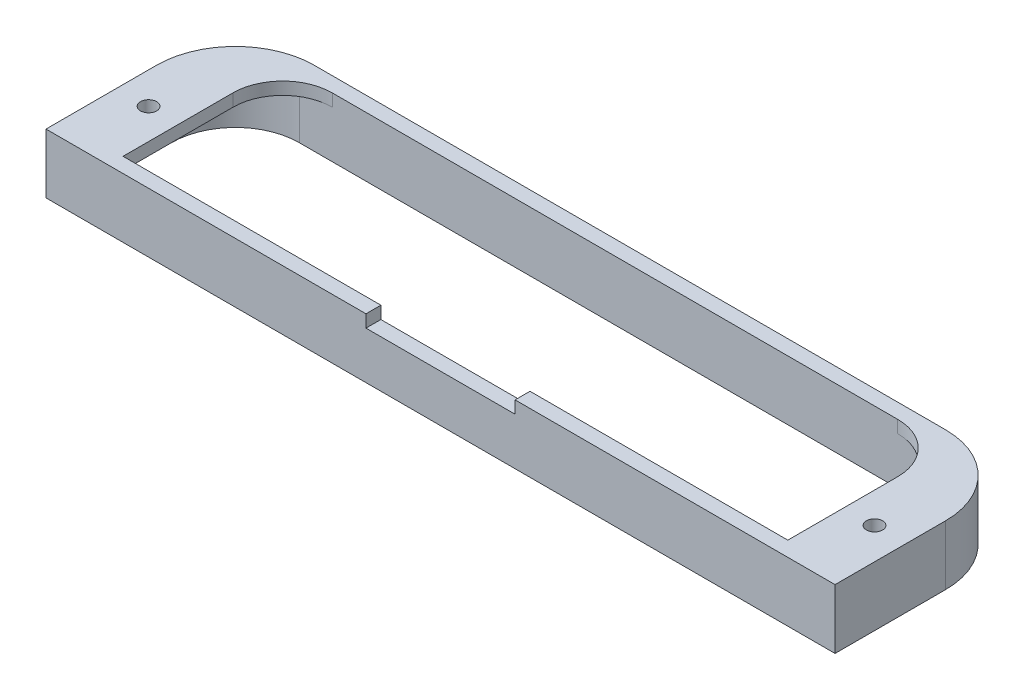
ISO-10303-21;
HEADER;
FILE_DESCRIPTION(('STEP AP214'),'2;1');
FILE_NAME('part.step','',(''),(''),'','','');
FILE_SCHEMA(('AUTOMOTIVE_DESIGN { 1 0 10303 214 1 1 1 1 }'));
ENDSEC;
DATA;
#1=APPLICATION_CONTEXT('core data for automotive mechanical design processes');
#2=APPLICATION_PROTOCOL_DEFINITION('international standard','automotive_design',2000,#1);
#3=PRODUCT_CONTEXT('',#1,'mechanical');
#4=PRODUCT('Part','Part','',(#3));
#5=PRODUCT_RELATED_PRODUCT_CATEGORY('part','',(#4));
#6=PRODUCT_DEFINITION_FORMATION('','',#4);
#7=PRODUCT_DEFINITION_CONTEXT('part definition',#1,'design');
#8=PRODUCT_DEFINITION('design','',#6,#7);
#9=PRODUCT_DEFINITION_SHAPE('','',#8);
#10=(LENGTH_UNIT() NAMED_UNIT(*) SI_UNIT(.MILLI.,.METRE.));
#11=(NAMED_UNIT(*) PLANE_ANGLE_UNIT() SI_UNIT($,.RADIAN.));
#12=(NAMED_UNIT(*) SI_UNIT($,.STERADIAN.) SOLID_ANGLE_UNIT());
#13=UNCERTAINTY_MEASURE_WITH_UNIT(LENGTH_MEASURE(1.E-05),#10,'distance_accuracy_value','');
#14=(GEOMETRIC_REPRESENTATION_CONTEXT(3) GLOBAL_UNCERTAINTY_ASSIGNED_CONTEXT((#13)) GLOBAL_UNIT_ASSIGNED_CONTEXT((#10,
#11,#12)) REPRESENTATION_CONTEXT('',''));
#15=CARTESIAN_POINT('',(0.,0.,0.));
#16=DIRECTION('',(0.,0.,1.));
#17=DIRECTION('',(1.,0.,0.));
#18=AXIS2_PLACEMENT_3D('',#15,#16,#17);
#19=CARTESIAN_POINT('',(50.8,0.,-17.78));
#20=DIRECTION('',(0.,1.,0.));
#21=DIRECTION('',(0.,0.,1.));
#22=AXIS2_PLACEMENT_3D('',#19,#20,#21);
#23=PLANE('',#22);
#24=CARTESIAN_POINT('',(-58.42,0.,-11.43));
#25=DIRECTION('',(0.,1.,0.));
#26=DIRECTION('',(0.,0.,1.));
#27=AXIS2_PLACEMENT_3D('',#24,#25,#26);
#28=CIRCLE('',#27,1.3);
#29=CARTESIAN_POINT('',(-58.42,0.,-10.13));
#30=VERTEX_POINT('',#29);
#31=EDGE_CURVE('E279',#30,#30,#28,.T.);
#32=ORIENTED_EDGE('',*,*,#31,.T.);
#33=EDGE_LOOP('',(#32));
#34=FACE_BOUND('',#33,.T.);
#35=DIRECTION('',(0.,0.,1.));
#36=VECTOR('',#35,1.);
#37=CARTESIAN_POINT('',(-53.5,0.,-2.4));
#38=LINE('',#37,#36);
#39=CARTESIAN_POINT('',(-53.5,0.,-20.08));
#40=VERTEX_POINT('',#39);
#41=CARTESIAN_POINT('',(-53.5,0.,-2.4));
#42=VERTEX_POINT('',#41);
#43=EDGE_CURVE('E306',#40,#42,#38,.T.);
#44=ORIENTED_EDGE('',*,*,#43,.T.);
#45=DIRECTION('',(-1.,0.,0.));
#46=VECTOR('',#45,1.);
#47=CARTESIAN_POINT('',(61.1,0.,-2.4));
#48=LINE('',#47,#46);
#49=CARTESIAN_POINT('',(-61.1,0.,-2.4));
#50=VERTEX_POINT('',#49);
#51=EDGE_CURVE('E11',#42,#50,#48,.T.);
#52=ORIENTED_EDGE('',*,*,#51,.T.);
#53=DIRECTION('',(0.,0.,-1.));
#54=VECTOR('',#53,1.);
#55=CARTESIAN_POINT('',(-61.1,0.,-2.4));
#56=LINE('',#55,#54);
#57=CARTESIAN_POINT('',(-61.1,0.,-17.78));
#58=VERTEX_POINT('',#57);
#59=EDGE_CURVE('E236',#50,#58,#56,.T.);
#60=ORIENTED_EDGE('',*,*,#59,.T.);
#61=CARTESIAN_POINT('',(-50.8,0.,-17.78));
#62=DIRECTION('',(0.,-1.,0.));
#63=DIRECTION('',(0.,0.,-1.));
#64=AXIS2_PLACEMENT_3D('',#61,#62,#63);
#65=CIRCLE('',#64,10.3);
#66=CARTESIAN_POINT('',(-50.8,0.,-28.08));
#67=VERTEX_POINT('',#66);
#68=EDGE_CURVE('E239',#58,#67,#65,.T.);
#69=ORIENTED_EDGE('',*,*,#68,.T.);
#70=DIRECTION('',(1.,0.,0.));
#71=VECTOR('',#70,1.);
#72=CARTESIAN_POINT('',(-50.8,0.,-28.08));
#73=LINE('',#72,#71);
#74=CARTESIAN_POINT('',(-45.5,0.,-28.08));
#75=VERTEX_POINT('',#74);
#76=EDGE_CURVE('E242',#67,#75,#73,.T.);
#77=ORIENTED_EDGE('',*,*,#76,.T.);
#78=CARTESIAN_POINT('',(-45.5,0.,-20.08));
#79=DIRECTION('',(0.,1.,0.));
#80=DIRECTION('',(0.,0.,-1.));
#81=AXIS2_PLACEMENT_3D('',#78,#79,#80);
#82=CIRCLE('',#81,8.);
#83=EDGE_CURVE('E288',#75,#40,#82,.T.);
#84=ORIENTED_EDGE('',*,*,#83,.T.);
#85=EDGE_LOOP('',(#44,#52,#60,#69,#77,#84));
#86=FACE_BOUND('',#85,.T.);
#87=ADVANCED_FACE('F37',(#34,#86),#23,.F.);
#88=CARTESIAN_POINT('',(58.42,0.,-11.43));
#89=DIRECTION('',(0.,1.,0.));
#90=DIRECTION('',(0.,0.,1.));
#91=AXIS2_PLACEMENT_3D('',#88,#89,#90);
#92=CIRCLE('',#91,1.3);
#93=CARTESIAN_POINT('',(58.42,0.,-10.13));
#94=VERTEX_POINT('',#93);
#95=EDGE_CURVE('E285',#94,#94,#92,.T.);
#96=ORIENTED_EDGE('',*,*,#95,.T.);
#97=EDGE_LOOP('',(#96));
#98=FACE_BOUND('',#97,.T.);
#99=DIRECTION('',(0.,0.,1.));
#100=VECTOR('',#99,1.);
#101=CARTESIAN_POINT('',(61.1,0.,-17.78));
#102=LINE('',#101,#100);
#103=CARTESIAN_POINT('',(61.1,0.,-17.78));
#104=VERTEX_POINT('',#103);
#105=CARTESIAN_POINT('',(61.1,0.,-2.4));
#106=VERTEX_POINT('',#105);
#107=EDGE_CURVE('E232',#104,#106,#102,.T.);
#108=ORIENTED_EDGE('',*,*,#107,.T.);
#109=CARTESIAN_POINT('',(53.5,0.,-2.4));
#110=VERTEX_POINT('',#109);
#111=EDGE_CURVE('E48',#106,#110,#48,.T.);
#112=ORIENTED_EDGE('',*,*,#111,.T.);
#113=DIRECTION('',(0.,0.,-1.));
#114=VECTOR('',#113,1.);
#115=CARTESIAN_POINT('',(53.5,0.,-20.08));
#116=LINE('',#115,#114);
#117=CARTESIAN_POINT('',(53.5,0.,-20.08));
#118=VERTEX_POINT('',#117);
#119=EDGE_CURVE('E309',#110,#118,#116,.T.);
#120=ORIENTED_EDGE('',*,*,#119,.T.);
#121=CARTESIAN_POINT('',(45.5,0.,-20.08));
#122=DIRECTION('',(0.,1.,0.));
#123=DIRECTION('',(0.,0.,-1.));
#124=AXIS2_PLACEMENT_3D('',#121,#122,#123);
#125=CIRCLE('',#124,8.);
#126=CARTESIAN_POINT('',(45.5,0.,-28.08));
#127=VERTEX_POINT('',#126);
#128=EDGE_CURVE('E292',#118,#127,#125,.T.);
#129=ORIENTED_EDGE('',*,*,#128,.T.);
#130=CARTESIAN_POINT('',(50.8,0.,-28.08));
#131=VERTEX_POINT('',#130);
#132=EDGE_CURVE('E46',#127,#131,#73,.T.);
#133=ORIENTED_EDGE('',*,*,#132,.T.);
#134=CARTESIAN_POINT('',(50.8,0.,-17.78));
#135=DIRECTION('',(0.,-1.,0.));
#136=DIRECTION('',(0.,0.,-1.));
#137=AXIS2_PLACEMENT_3D('',#134,#135,#136);
#138=CIRCLE('',#137,10.3);
#139=EDGE_CURVE('E221',#131,#104,#138,.T.);
#140=ORIENTED_EDGE('',*,*,#139,.T.);
#141=EDGE_LOOP('',(#108,#112,#120,#129,#133,#140));
#142=FACE_BOUND('',#141,.T.);
#143=ADVANCED_FACE('F363',(#98,#142),#23,.F.);
#144=CARTESIAN_POINT('',(50.8,2.,-17.78));
#145=DIRECTION('',(0.,1.,0.));
#146=DIRECTION('',(0.,0.,1.));
#147=AXIS2_PLACEMENT_3D('',#144,#145,#146);
#148=PLANE('',#147);
#149=DIRECTION('',(0.,0.,-1.));
#150=VECTOR('',#149,1.);
#151=CARTESIAN_POINT('',(12.,2.,0.));
#152=LINE('',#151,#150);
#153=CARTESIAN_POINT('',(12.,2.,0.));
#154=VERTEX_POINT('',#153);
#155=CARTESIAN_POINT('',(12.,2.,-2.4));
#156=VERTEX_POINT('',#155);
#157=EDGE_CURVE('E205',#154,#156,#152,.T.);
#158=ORIENTED_EDGE('',*,*,#157,.F.);
#159=DIRECTION('',(1.,0.,0.));
#160=VECTOR('',#159,1.);
#161=CARTESIAN_POINT('',(-63.5,2.,0.));
#162=LINE('',#161,#160);
#163=CARTESIAN_POINT('',(63.5,2.,0.));
#164=VERTEX_POINT('',#163);
#165=EDGE_CURVE('E333',#154,#164,#162,.T.);
#166=ORIENTED_EDGE('',*,*,#165,.T.);
#167=DIRECTION('',(0.,0.,-1.));
#168=VECTOR('',#167,1.);
#169=CARTESIAN_POINT('',(63.5,2.,0.));
#170=LINE('',#169,#168);
#171=CARTESIAN_POINT('',(63.5,2.,-17.78));
#172=VERTEX_POINT('',#171);
#173=EDGE_CURVE('E337',#164,#172,#170,.T.);
#174=ORIENTED_EDGE('',*,*,#173,.T.);
#175=CARTESIAN_POINT('',(50.8,2.,-17.78));
#176=DIRECTION('',(0.,1.,0.));
#177=DIRECTION('',(0.,0.,1.));
#178=AXIS2_PLACEMENT_3D('',#175,#176,#177);
#179=CIRCLE('',#178,12.7);
#180=CARTESIAN_POINT('',(50.8,2.,-30.48));
#181=VERTEX_POINT('',#180);
#182=EDGE_CURVE('E339',#172,#181,#179,.T.);
#183=ORIENTED_EDGE('',*,*,#182,.T.);
#184=DIRECTION('',(-1.,0.,0.));
#185=VECTOR('',#184,1.);
#186=CARTESIAN_POINT('',(50.8,2.,-30.48));
#187=LINE('',#186,#185);
#188=CARTESIAN_POINT('',(-50.8,2.,-30.48));
#189=VERTEX_POINT('',#188);
#190=EDGE_CURVE('E341',#181,#189,#187,.T.);
#191=ORIENTED_EDGE('',*,*,#190,.T.);
#192=CARTESIAN_POINT('',(-50.8,2.,-17.78));
#193=DIRECTION('',(0.,1.,0.));
#194=DIRECTION('',(0.,0.,1.));
#195=AXIS2_PLACEMENT_3D('',#192,#193,#194);
#196=CIRCLE('',#195,12.7);
#197=CARTESIAN_POINT('',(-63.5,2.,-17.78));
#198=VERTEX_POINT('',#197);
#199=EDGE_CURVE('E343',#189,#198,#196,.T.);
#200=ORIENTED_EDGE('',*,*,#199,.T.);
#201=DIRECTION('',(0.,0.,1.));
#202=VECTOR('',#201,1.);
#203=CARTESIAN_POINT('',(-63.5,2.,-17.78));
#204=LINE('',#203,#202);
#205=CARTESIAN_POINT('',(-63.5,2.,0.));
#206=VERTEX_POINT('',#205);
#207=EDGE_CURVE('E330',#198,#206,#204,.T.);
#208=ORIENTED_EDGE('',*,*,#207,.T.);
#209=CARTESIAN_POINT('',(-12.,2.,0.));
#210=VERTEX_POINT('',#209);
#211=EDGE_CURVE('E334',#206,#210,#162,.T.);
#212=ORIENTED_EDGE('',*,*,#211,.T.);
#213=DIRECTION('',(0.,0.,1.));
#214=VECTOR('',#213,1.);
#215=CARTESIAN_POINT('',(-12.,2.,-2.4));
#216=LINE('',#215,#214);
#217=CARTESIAN_POINT('',(-12.,2.,-2.4));
#218=VERTEX_POINT('',#217);
#219=EDGE_CURVE('E408',#218,#210,#216,.T.);
#220=ORIENTED_EDGE('',*,*,#219,.F.);
#221=DIRECTION('',(1.,0.,0.));
#222=VECTOR('',#221,1.);
#223=CARTESIAN_POINT('',(-53.5,2.,-2.4));
#224=LINE('',#223,#222);
#225=CARTESIAN_POINT('',(-53.5,2.,-2.4));
#226=VERTEX_POINT('',#225);
#227=EDGE_CURVE('E211',#226,#218,#224,.T.);
#228=ORIENTED_EDGE('',*,*,#227,.F.);
#229=DIRECTION('',(0.,0.,1.));
#230=VECTOR('',#229,1.);
#231=CARTESIAN_POINT('',(-53.5,2.,-2.4));
#232=LINE('',#231,#230);
#233=CARTESIAN_POINT('',(-53.5,2.,-20.08));
#234=VERTEX_POINT('',#233);
#235=EDGE_CURVE('E291',#234,#226,#232,.T.);
#236=ORIENTED_EDGE('',*,*,#235,.F.);
#237=CARTESIAN_POINT('',(-45.5,2.,-20.08));
#238=DIRECTION('',(0.,1.,0.));
#239=DIRECTION('',(0.,0.,-1.));
#240=AXIS2_PLACEMENT_3D('',#237,#238,#239);
#241=CIRCLE('',#240,8.);
#242=CARTESIAN_POINT('',(-45.5,2.,-28.08));
#243=VERTEX_POINT('',#242);
#244=EDGE_CURVE('E289',#243,#234,#241,.T.);
#245=ORIENTED_EDGE('',*,*,#244,.F.);
#246=DIRECTION('',(-1.,0.,0.));
#247=VECTOR('',#246,1.);
#248=CARTESIAN_POINT('',(-45.5,2.,-28.08));
#249=LINE('',#248,#247);
#250=CARTESIAN_POINT('',(45.5,2.,-28.08));
#251=VERTEX_POINT('',#250);
#252=EDGE_CURVE('E301',#251,#243,#249,.T.);
#253=ORIENTED_EDGE('',*,*,#252,.F.);
#254=CARTESIAN_POINT('',(45.5,2.,-20.08));
#255=DIRECTION('',(0.,1.,0.));
#256=DIRECTION('',(0.,0.,-1.));
#257=AXIS2_PLACEMENT_3D('',#254,#255,#256);
#258=CIRCLE('',#257,8.);
#259=CARTESIAN_POINT('',(53.5,2.,-20.08));
#260=VERTEX_POINT('',#259);
#261=EDGE_CURVE('E298',#260,#251,#258,.T.);
#262=ORIENTED_EDGE('',*,*,#261,.F.);
#263=DIRECTION('',(0.,0.,-1.));
#264=VECTOR('',#263,1.);
#265=CARTESIAN_POINT('',(53.5,2.,-20.08));
#266=LINE('',#265,#264);
#267=CARTESIAN_POINT('',(53.5,2.,-2.4));
#268=VERTEX_POINT('',#267);
#269=EDGE_CURVE('E296',#268,#260,#266,.T.);
#270=ORIENTED_EDGE('',*,*,#269,.F.);
#271=EDGE_CURVE('E294',#156,#268,#224,.T.);
#272=ORIENTED_EDGE('',*,*,#271,.F.);
#273=EDGE_LOOP('',(#158,#166,#174,#183,#191,#200,#208,#212,#220,#228,#236,#245,#253,#262,#270,#272));
#274=FACE_BOUND('',#273,.T.);
#275=CARTESIAN_POINT('',(-58.42,2.,-11.43));
#276=DIRECTION('',(0.,1.,0.));
#277=DIRECTION('',(0.,0.,1.));
#278=AXIS2_PLACEMENT_3D('',#275,#276,#277);
#279=CIRCLE('',#278,1.29999999999999);
#280=CARTESIAN_POINT('',(-58.42,2.,-10.13));
#281=VERTEX_POINT('',#280);
#282=EDGE_CURVE('E276',#281,#281,#279,.T.);
#283=ORIENTED_EDGE('',*,*,#282,.F.);
#284=EDGE_LOOP('',(#283));
#285=FACE_BOUND('',#284,.T.);
#286=CARTESIAN_POINT('',(58.42,2.,-11.43));
#287=DIRECTION('',(0.,1.,0.));
#288=DIRECTION('',(0.,0.,1.));
#289=AXIS2_PLACEMENT_3D('',#286,#287,#288);
#290=CIRCLE('',#289,1.29999999999999);
#291=CARTESIAN_POINT('',(58.42,2.,-10.13));
#292=VERTEX_POINT('',#291);
#293=EDGE_CURVE('E282',#292,#292,#290,.T.);
#294=ORIENTED_EDGE('',*,*,#293,.F.);
#295=EDGE_LOOP('',(#294));
#296=FACE_BOUND('',#295,.T.);
#297=ADVANCED_FACE('F376',(#274,#285,#296),#148,.T.);
#298=CARTESIAN_POINT('',(-63.5,2.,-17.78));
#299=DIRECTION('',(1.,0.,0.));
#300=DIRECTION('',(0.,0.,-1.));
#301=AXIS2_PLACEMENT_3D('',#298,#299,#300);
#302=PLANE('',#301);
#303=DIRECTION('',(0.,-1.,0.));
#304=VECTOR('',#303,1.);
#305=CARTESIAN_POINT('',(-63.5,2.,-17.78));
#306=LINE('',#305,#304);
#307=CARTESIAN_POINT('',(-63.5,-7.6,-17.78));
#308=VERTEX_POINT('',#307);
#309=EDGE_CURVE('E345',#198,#308,#306,.T.);
#310=ORIENTED_EDGE('',*,*,#309,.T.);
#311=DIRECTION('',(0.,0.,-1.));
#312=VECTOR('',#311,1.);
#313=CARTESIAN_POINT('',(-63.5,-7.6,0.));
#314=LINE('',#313,#312);
#315=CARTESIAN_POINT('',(-63.5,-7.6,0.));
#316=VERTEX_POINT('',#315);
#317=EDGE_CURVE('E261',#316,#308,#314,.T.);
#318=ORIENTED_EDGE('',*,*,#317,.F.);
#319=DIRECTION('',(0.,-1.,0.));
#320=VECTOR('',#319,1.);
#321=CARTESIAN_POINT('',(-63.5,2.,0.));
#322=LINE('',#321,#320);
#323=EDGE_CURVE('E41',#206,#316,#322,.T.);
#324=ORIENTED_EDGE('',*,*,#323,.F.);
#325=ORIENTED_EDGE('',*,*,#207,.F.);
#326=EDGE_LOOP('',(#310,#318,#324,#325));
#327=FACE_BOUND('',#326,.T.);
#328=ADVANCED_FACE('F39',(#327),#302,.F.);
#329=CARTESIAN_POINT('',(53.5,2.,0.));
#330=DIRECTION('',(0.,0.,-1.));
#331=DIRECTION('',(-1.,0.,0.));
#332=AXIS2_PLACEMENT_3D('',#329,#330,#331);
#333=PLANE('',#332);
#334=ORIENTED_EDGE('',*,*,#165,.F.);
#335=DIRECTION('',(0.,1.,0.));
#336=VECTOR('',#335,1.);
#337=CARTESIAN_POINT('',(12.,0.,0.));
#338=LINE('',#337,#336);
#339=CARTESIAN_POINT('',(12.,0.,0.));
#340=VERTEX_POINT('',#339);
#341=EDGE_CURVE('E213',#340,#154,#338,.T.);
#342=ORIENTED_EDGE('',*,*,#341,.F.);
#343=DIRECTION('',(1.,0.,0.));
#344=VECTOR('',#343,1.);
#345=CARTESIAN_POINT('',(-12.,0.,0.));
#346=LINE('',#345,#344);
#347=CARTESIAN_POINT('',(-12.,0.,0.));
#348=VERTEX_POINT('',#347);
#349=EDGE_CURVE('E198',#348,#340,#346,.T.);
#350=ORIENTED_EDGE('',*,*,#349,.F.);
#351=DIRECTION('',(0.,1.,0.));
#352=VECTOR('',#351,1.);
#353=CARTESIAN_POINT('',(-12.,0.,0.));
#354=LINE('',#353,#352);
#355=EDGE_CURVE('E196',#348,#210,#354,.T.);
#356=ORIENTED_EDGE('',*,*,#355,.T.);
#357=ORIENTED_EDGE('',*,*,#211,.F.);
#358=ORIENTED_EDGE('',*,*,#323,.T.);
#359=DIRECTION('',(-1.,0.,0.));
#360=VECTOR('',#359,1.);
#361=CARTESIAN_POINT('',(63.5,-7.6,0.));
#362=LINE('',#361,#360);
#363=CARTESIAN_POINT('',(63.5,-7.6,0.));
#364=VERTEX_POINT('',#363);
#365=EDGE_CURVE('E258',#364,#316,#362,.T.);
#366=ORIENTED_EDGE('',*,*,#365,.F.);
#367=DIRECTION('',(0.,-1.,0.));
#368=VECTOR('',#367,1.);
#369=CARTESIAN_POINT('',(63.5,2.,0.));
#370=LINE('',#369,#368);
#371=EDGE_CURVE('E352',#164,#364,#370,.T.);
#372=ORIENTED_EDGE('',*,*,#371,.F.);
#373=EDGE_LOOP('',(#334,#342,#350,#356,#357,#358,#366,#372));
#374=FACE_BOUND('',#373,.T.);
#375=ADVANCED_FACE('F411',(#374),#333,.F.);
#376=CARTESIAN_POINT('',(63.5,2.,0.));
#377=DIRECTION('',(-1.,0.,0.));
#378=DIRECTION('',(0.,0.,1.));
#379=AXIS2_PLACEMENT_3D('',#376,#377,#378);
#380=PLANE('',#379);
#381=ORIENTED_EDGE('',*,*,#371,.T.);
#382=DIRECTION('',(0.,0.,1.));
#383=VECTOR('',#382,1.);
#384=CARTESIAN_POINT('',(63.5,-7.6,-17.78));
#385=LINE('',#384,#383);
#386=CARTESIAN_POINT('',(63.5,-7.6,-17.78));
#387=VERTEX_POINT('',#386);
#388=EDGE_CURVE('E273',#387,#364,#385,.T.);
#389=ORIENTED_EDGE('',*,*,#388,.F.);
#390=DIRECTION('',(0.,-1.,0.));
#391=VECTOR('',#390,1.);
#392=CARTESIAN_POINT('',(63.5,2.,-17.78));
#393=LINE('',#392,#391);
#394=EDGE_CURVE('E351',#172,#387,#393,.T.);
#395=ORIENTED_EDGE('',*,*,#394,.F.);
#396=ORIENTED_EDGE('',*,*,#173,.F.);
#397=EDGE_LOOP('',(#381,#389,#395,#396));
#398=FACE_BOUND('',#397,.T.);
#399=ADVANCED_FACE('F413',(#398),#380,.F.);
#400=CARTESIAN_POINT('',(50.8,2.,-17.78));
#401=DIRECTION('',(0.,-1.,0.));
#402=DIRECTION('',(0.,0.,-1.));
#403=AXIS2_PLACEMENT_3D('',#400,#401,#402);
#404=CYLINDRICAL_SURFACE('',#403,12.7);
#405=ORIENTED_EDGE('',*,*,#394,.T.);
#406=CARTESIAN_POINT('',(50.8,-7.6,-17.78));
#407=DIRECTION('',(0.,-1.,0.));
#408=DIRECTION('',(0.,0.,-1.));
#409=AXIS2_PLACEMENT_3D('',#406,#407,#408);
#410=CIRCLE('',#409,12.7);
#411=CARTESIAN_POINT('',(50.8,-7.6,-30.48));
#412=VERTEX_POINT('',#411);
#413=EDGE_CURVE('E270',#412,#387,#410,.T.);
#414=ORIENTED_EDGE('',*,*,#413,.F.);
#415=DIRECTION('',(0.,-1.,0.));
#416=VECTOR('',#415,1.);
#417=CARTESIAN_POINT('',(50.8,2.,-30.48));
#418=LINE('',#417,#416);
#419=EDGE_CURVE('E349',#181,#412,#418,.T.);
#420=ORIENTED_EDGE('',*,*,#419,.F.);
#421=ORIENTED_EDGE('',*,*,#182,.F.);
#422=EDGE_LOOP('',(#405,#414,#420,#421));
#423=FACE_BOUND('',#422,.T.);
#424=ADVANCED_FACE('F420',(#423),#404,.T.);
#425=CARTESIAN_POINT('',(50.8,2.,-30.48));
#426=DIRECTION('',(0.,0.,1.));
#427=DIRECTION('',(1.,0.,0.));
#428=AXIS2_PLACEMENT_3D('',#425,#426,#427);
#429=PLANE('',#428);
#430=ORIENTED_EDGE('',*,*,#419,.T.);
#431=DIRECTION('',(1.,0.,0.));
#432=VECTOR('',#431,1.);
#433=CARTESIAN_POINT('',(-50.8,-7.6,-30.48));
#434=LINE('',#433,#432);
#435=CARTESIAN_POINT('',(-50.8,-7.6,-30.48));
#436=VERTEX_POINT('',#435);
#437=EDGE_CURVE('E267',#436,#412,#434,.T.);
#438=ORIENTED_EDGE('',*,*,#437,.F.);
#439=DIRECTION('',(0.,-1.,0.));
#440=VECTOR('',#439,1.);
#441=CARTESIAN_POINT('',(-50.8,2.,-30.48));
#442=LINE('',#441,#440);
#443=EDGE_CURVE('E347',#189,#436,#442,.T.);
#444=ORIENTED_EDGE('',*,*,#443,.F.);
#445=ORIENTED_EDGE('',*,*,#190,.F.);
#446=EDGE_LOOP('',(#430,#438,#444,#445));
#447=FACE_BOUND('',#446,.T.);
#448=ADVANCED_FACE('F423',(#447),#429,.F.);
#449=CARTESIAN_POINT('',(-50.8,2.,-17.78));
#450=DIRECTION('',(0.,-1.,0.));
#451=DIRECTION('',(0.,0.,-1.));
#452=AXIS2_PLACEMENT_3D('',#449,#450,#451);
#453=CYLINDRICAL_SURFACE('',#452,12.7);
#454=ORIENTED_EDGE('',*,*,#443,.T.);
#455=CARTESIAN_POINT('',(-50.8,-7.6,-17.78));
#456=DIRECTION('',(0.,-1.,0.));
#457=DIRECTION('',(0.,0.,-1.));
#458=AXIS2_PLACEMENT_3D('',#455,#456,#457);
#459=CIRCLE('',#458,12.7);
#460=EDGE_CURVE('E264',#308,#436,#459,.T.);
#461=ORIENTED_EDGE('',*,*,#460,.F.);
#462=ORIENTED_EDGE('',*,*,#309,.F.);
#463=ORIENTED_EDGE('',*,*,#199,.F.);
#464=EDGE_LOOP('',(#454,#461,#462,#463));
#465=FACE_BOUND('',#464,.T.);
#466=ADVANCED_FACE('F428',(#465),#453,.T.);
#467=CARTESIAN_POINT('',(-45.5,2.,-20.08));
#468=DIRECTION('',(0.,-1.,0.));
#469=DIRECTION('',(0.,0.,-1.));
#470=AXIS2_PLACEMENT_3D('',#467,#468,#469);
#471=CYLINDRICAL_SURFACE('',#470,8.);
#472=ORIENTED_EDGE('',*,*,#83,.F.);
#473=DIRECTION('',(0.,-1.,0.));
#474=VECTOR('',#473,1.);
#475=CARTESIAN_POINT('',(-45.5,2.,-28.08));
#476=LINE('',#475,#474);
#477=EDGE_CURVE('E303',#243,#75,#476,.T.);
#478=ORIENTED_EDGE('',*,*,#477,.F.);
#479=ORIENTED_EDGE('',*,*,#244,.T.);
#480=DIRECTION('',(0.,-1.,0.));
#481=VECTOR('',#480,1.);
#482=CARTESIAN_POINT('',(-53.5,2.,-20.08));
#483=LINE('',#482,#481);
#484=EDGE_CURVE('E327',#234,#40,#483,.T.);
#485=ORIENTED_EDGE('',*,*,#484,.T.);
#486=EDGE_LOOP('',(#472,#478,#479,#485));
#487=FACE_BOUND('',#486,.T.);
#488=ADVANCED_FACE('F383',(#487),#471,.F.);
#489=CARTESIAN_POINT('',(-53.5,2.,-2.4));
#490=DIRECTION('',(1.,0.,0.));
#491=DIRECTION('',(0.,0.,-1.));
#492=AXIS2_PLACEMENT_3D('',#489,#490,#491);
#493=PLANE('',#492);
#494=ORIENTED_EDGE('',*,*,#43,.F.);
#495=ORIENTED_EDGE('',*,*,#484,.F.);
#496=ORIENTED_EDGE('',*,*,#235,.T.);
#497=DIRECTION('',(0.,-1.,0.));
#498=VECTOR('',#497,1.);
#499=CARTESIAN_POINT('',(-53.5,2.,-2.4));
#500=LINE('',#499,#498);
#501=EDGE_CURVE('E324',#226,#42,#500,.T.);
#502=ORIENTED_EDGE('',*,*,#501,.T.);
#503=EDGE_LOOP('',(#494,#495,#496,#502));
#504=FACE_BOUND('',#503,.T.);
#505=ADVANCED_FACE('F523',(#504),#493,.T.);
#506=CARTESIAN_POINT('',(-53.5,2.,-2.4));
#507=DIRECTION('',(0.,0.,-1.));
#508=DIRECTION('',(-1.,0.,0.));
#509=AXIS2_PLACEMENT_3D('',#506,#507,#508);
#510=PLANE('',#509);
#511=DIRECTION('',(0.,1.,0.));
#512=VECTOR('',#511,1.);
#513=CARTESIAN_POINT('',(12.,0.,-2.4));
#514=LINE('',#513,#512);
#515=CARTESIAN_POINT('',(12.,0.,-2.4));
#516=VERTEX_POINT('',#515);
#517=EDGE_CURVE('E234',#516,#156,#514,.T.);
#518=ORIENTED_EDGE('',*,*,#517,.T.);
#519=ORIENTED_EDGE('',*,*,#271,.T.);
#520=DIRECTION('',(0.,-1.,0.));
#521=VECTOR('',#520,1.);
#522=CARTESIAN_POINT('',(53.5,2.,-2.4));
#523=LINE('',#522,#521);
#524=EDGE_CURVE('E321',#268,#110,#523,.T.);
#525=ORIENTED_EDGE('',*,*,#524,.T.);
#526=ORIENTED_EDGE('',*,*,#111,.F.);
#527=DIRECTION('',(0.,1.,0.));
#528=VECTOR('',#527,1.);
#529=CARTESIAN_POINT('',(61.1,-7.6,-2.4));
#530=LINE('',#529,#528);
#531=CARTESIAN_POINT('',(61.1,-7.6,-2.4));
#532=VERTEX_POINT('',#531);
#533=EDGE_CURVE('E255',#532,#106,#530,.T.);
#534=ORIENTED_EDGE('',*,*,#533,.F.);
#535=DIRECTION('',(-1.,0.,0.));
#536=VECTOR('',#535,1.);
#537=CARTESIAN_POINT('',(61.1,-7.6,-2.4));
#538=LINE('',#537,#536);
#539=CARTESIAN_POINT('',(-61.1,-7.6,-2.4));
#540=VERTEX_POINT('',#539);
#541=EDGE_CURVE('E220',#532,#540,#538,.T.);
#542=ORIENTED_EDGE('',*,*,#541,.T.);
#543=DIRECTION('',(0.,1.,0.));
#544=VECTOR('',#543,1.);
#545=CARTESIAN_POINT('',(-61.1,-7.6,-2.4));
#546=LINE('',#545,#544);
#547=EDGE_CURVE('E253',#540,#50,#546,.T.);
#548=ORIENTED_EDGE('',*,*,#547,.T.);
#549=ORIENTED_EDGE('',*,*,#51,.F.);
#550=ORIENTED_EDGE('',*,*,#501,.F.);
#551=ORIENTED_EDGE('',*,*,#227,.T.);
#552=DIRECTION('',(0.,1.,0.));
#553=VECTOR('',#552,1.);
#554=CARTESIAN_POINT('',(-12.,0.,-2.4));
#555=LINE('',#554,#553);
#556=CARTESIAN_POINT('',(-12.,0.,-2.4));
#557=VERTEX_POINT('',#556);
#558=EDGE_CURVE('E193',#557,#218,#555,.T.);
#559=ORIENTED_EDGE('',*,*,#558,.F.);
#560=DIRECTION('',(-1.,0.,0.));
#561=VECTOR('',#560,1.);
#562=CARTESIAN_POINT('',(12.,0.,-2.4));
#563=LINE('',#562,#561);
#564=EDGE_CURVE('E199',#516,#557,#563,.T.);
#565=ORIENTED_EDGE('',*,*,#564,.F.);
#566=EDGE_LOOP('',(#518,#519,#525,#526,#534,#542,#548,#549,#550,#551,#559,#565));
#567=FACE_BOUND('',#566,.T.);
#568=ADVANCED_FACE('F208',(#567),#510,.T.);
#569=CARTESIAN_POINT('',(53.5,2.,-20.08));
#570=DIRECTION('',(-1.,0.,0.));
#571=DIRECTION('',(0.,0.,1.));
#572=AXIS2_PLACEMENT_3D('',#569,#570,#571);
#573=PLANE('',#572);
#574=ORIENTED_EDGE('',*,*,#119,.F.);
#575=ORIENTED_EDGE('',*,*,#524,.F.);
#576=ORIENTED_EDGE('',*,*,#269,.T.);
#577=DIRECTION('',(0.,-1.,0.));
#578=VECTOR('',#577,1.);
#579=CARTESIAN_POINT('',(53.5,2.,-20.08));
#580=LINE('',#579,#578);
#581=EDGE_CURVE('E319',#260,#118,#580,.T.);
#582=ORIENTED_EDGE('',*,*,#581,.T.);
#583=EDGE_LOOP('',(#574,#575,#576,#582));
#584=FACE_BOUND('',#583,.T.);
#585=ADVANCED_FACE('F405',(#584),#573,.T.);
#586=CARTESIAN_POINT('',(45.5,2.,-20.08));
#587=DIRECTION('',(0.,-1.,0.));
#588=DIRECTION('',(0.,0.,-1.));
#589=AXIS2_PLACEMENT_3D('',#586,#587,#588);
#590=CYLINDRICAL_SURFACE('',#589,8.);
#591=ORIENTED_EDGE('',*,*,#128,.F.);
#592=ORIENTED_EDGE('',*,*,#581,.F.);
#593=ORIENTED_EDGE('',*,*,#261,.T.);
#594=DIRECTION('',(0.,-1.,0.));
#595=VECTOR('',#594,1.);
#596=CARTESIAN_POINT('',(45.5,2.,-28.08));
#597=LINE('',#596,#595);
#598=EDGE_CURVE('E316',#251,#127,#597,.T.);
#599=ORIENTED_EDGE('',*,*,#598,.T.);
#600=EDGE_LOOP('',(#591,#592,#593,#599));
#601=FACE_BOUND('',#600,.T.);
#602=ADVANCED_FACE('F368',(#601),#590,.F.);
#603=CARTESIAN_POINT('',(-45.5,2.,-28.08));
#604=DIRECTION('',(0.,0.,1.));
#605=DIRECTION('',(1.,0.,0.));
#606=AXIS2_PLACEMENT_3D('',#603,#604,#605);
#607=PLANE('',#606);
#608=ORIENTED_EDGE('',*,*,#477,.T.);
#609=ORIENTED_EDGE('',*,*,#76,.F.);
#610=DIRECTION('',(0.,1.,0.));
#611=VECTOR('',#610,1.);
#612=CARTESIAN_POINT('',(-50.8,-7.6,-28.08));
#613=LINE('',#612,#611);
#614=CARTESIAN_POINT('',(-50.8,-7.6,-28.08));
#615=VERTEX_POINT('',#614);
#616=EDGE_CURVE('E249',#615,#67,#613,.T.);
#617=ORIENTED_EDGE('',*,*,#616,.F.);
#618=DIRECTION('',(1.,0.,0.));
#619=VECTOR('',#618,1.);
#620=CARTESIAN_POINT('',(-50.8,-7.6,-28.08));
#621=LINE('',#620,#619);
#622=CARTESIAN_POINT('',(50.8,-7.6,-28.08));
#623=VERTEX_POINT('',#622);
#624=EDGE_CURVE('E227',#615,#623,#621,.T.);
#625=ORIENTED_EDGE('',*,*,#624,.T.);
#626=DIRECTION('',(0.,1.,0.));
#627=VECTOR('',#626,1.);
#628=CARTESIAN_POINT('',(50.8,-7.6,-28.08));
#629=LINE('',#628,#627);
#630=EDGE_CURVE('E247',#623,#131,#629,.T.);
#631=ORIENTED_EDGE('',*,*,#630,.T.);
#632=ORIENTED_EDGE('',*,*,#132,.F.);
#633=ORIENTED_EDGE('',*,*,#598,.F.);
#634=ORIENTED_EDGE('',*,*,#252,.T.);
#635=EDGE_LOOP('',(#608,#609,#617,#625,#631,#632,#633,#634));
#636=FACE_BOUND('',#635,.T.);
#637=ADVANCED_FACE('F366',(#636),#607,.T.);
#638=CARTESIAN_POINT('',(58.42,2.,-11.43));
#639=DIRECTION('',(0.,1.,0.));
#640=DIRECTION('',(0.,0.,1.));
#641=AXIS2_PLACEMENT_3D('',#638,#639,#640);
#642=CYLINDRICAL_SURFACE('',#641,1.3);
#643=ORIENTED_EDGE('',*,*,#95,.F.);
#644=EDGE_LOOP('',(#643));
#645=FACE_BOUND('',#644,.T.);
#646=ORIENTED_EDGE('',*,*,#293,.T.);
#647=EDGE_LOOP('',(#646));
#648=FACE_BOUND('',#647,.T.);
#649=ADVANCED_FACE('F441',(#645,#648),#642,.F.);
#650=CARTESIAN_POINT('',(-58.42,2.,-11.43));
#651=DIRECTION('',(0.,1.,0.));
#652=DIRECTION('',(0.,0.,1.));
#653=AXIS2_PLACEMENT_3D('',#650,#651,#652);
#654=CYLINDRICAL_SURFACE('',#653,1.3);
#655=ORIENTED_EDGE('',*,*,#31,.F.);
#656=EDGE_LOOP('',(#655));
#657=FACE_BOUND('',#656,.T.);
#658=ORIENTED_EDGE('',*,*,#282,.T.);
#659=EDGE_LOOP('',(#658));
#660=FACE_BOUND('',#659,.T.);
#661=ADVANCED_FACE('F433',(#657,#660),#654,.F.);
#662=CARTESIAN_POINT('',(-50.8,-7.6,-17.78));
#663=DIRECTION('',(0.,-1.,0.));
#664=DIRECTION('',(0.,0.,-1.));
#665=AXIS2_PLACEMENT_3D('',#662,#663,#664);
#666=PLANE('',#665);
#667=ORIENTED_EDGE('',*,*,#365,.T.);
#668=ORIENTED_EDGE('',*,*,#317,.T.);
#669=ORIENTED_EDGE('',*,*,#460,.T.);
#670=ORIENTED_EDGE('',*,*,#437,.T.);
#671=ORIENTED_EDGE('',*,*,#413,.T.);
#672=ORIENTED_EDGE('',*,*,#388,.T.);
#673=EDGE_LOOP('',(#667,#668,#669,#670,#671,#672));
#674=FACE_BOUND('',#673,.T.);
#675=ORIENTED_EDGE('',*,*,#541,.F.);
#676=DIRECTION('',(0.,0.,1.));
#677=VECTOR('',#676,1.);
#678=CARTESIAN_POINT('',(61.1,-7.6,-17.78));
#679=LINE('',#678,#677);
#680=CARTESIAN_POINT('',(61.1,-7.6,-17.78));
#681=VERTEX_POINT('',#680);
#682=EDGE_CURVE('E218',#681,#532,#679,.T.);
#683=ORIENTED_EDGE('',*,*,#682,.F.);
#684=CARTESIAN_POINT('',(50.8,-7.6,-17.78));
#685=DIRECTION('',(0.,-1.,0.));
#686=DIRECTION('',(0.,0.,-1.));
#687=AXIS2_PLACEMENT_3D('',#684,#685,#686);
#688=CIRCLE('',#687,10.3);
#689=EDGE_CURVE('E230',#623,#681,#688,.T.);
#690=ORIENTED_EDGE('',*,*,#689,.F.);
#691=ORIENTED_EDGE('',*,*,#624,.F.);
#692=CARTESIAN_POINT('',(-50.8,-7.6,-17.78));
#693=DIRECTION('',(0.,-1.,0.));
#694=DIRECTION('',(0.,0.,-1.));
#695=AXIS2_PLACEMENT_3D('',#692,#693,#694);
#696=CIRCLE('',#695,10.3);
#697=CARTESIAN_POINT('',(-61.1,-7.6,-17.78));
#698=VERTEX_POINT('',#697);
#699=EDGE_CURVE('E225',#698,#615,#696,.T.);
#700=ORIENTED_EDGE('',*,*,#699,.F.);
#701=DIRECTION('',(0.,0.,-1.));
#702=VECTOR('',#701,1.);
#703=CARTESIAN_POINT('',(-61.1,-7.6,-2.4));
#704=LINE('',#703,#702);
#705=EDGE_CURVE('E223',#540,#698,#704,.T.);
#706=ORIENTED_EDGE('',*,*,#705,.F.);
#707=EDGE_LOOP('',(#675,#683,#690,#691,#700,#706));
#708=FACE_BOUND('',#707,.T.);
#709=ADVANCED_FACE('F394',(#674,#708),#666,.T.);
#710=CARTESIAN_POINT('',(61.1,-7.6,-17.78));
#711=DIRECTION('',(-1.,0.,0.));
#712=DIRECTION('',(0.,0.,1.));
#713=AXIS2_PLACEMENT_3D('',#710,#711,#712);
#714=PLANE('',#713);
#715=ORIENTED_EDGE('',*,*,#107,.F.);
#716=DIRECTION('',(0.,1.,0.));
#717=VECTOR('',#716,1.);
#718=CARTESIAN_POINT('',(61.1,-7.6,-17.78));
#719=LINE('',#718,#717);
#720=EDGE_CURVE('E63',#681,#104,#719,.T.);
#721=ORIENTED_EDGE('',*,*,#720,.F.);
#722=ORIENTED_EDGE('',*,*,#682,.T.);
#723=ORIENTED_EDGE('',*,*,#533,.T.);
#724=EDGE_LOOP('',(#715,#721,#722,#723));
#725=FACE_BOUND('',#724,.T.);
#726=ADVANCED_FACE('F399',(#725),#714,.T.);
#727=CARTESIAN_POINT('',(-61.1,-7.6,-2.4));
#728=DIRECTION('',(1.,0.,0.));
#729=DIRECTION('',(0.,0.,-1.));
#730=AXIS2_PLACEMENT_3D('',#727,#728,#729);
#731=PLANE('',#730);
#732=ORIENTED_EDGE('',*,*,#59,.F.);
#733=ORIENTED_EDGE('',*,*,#547,.F.);
#734=ORIENTED_EDGE('',*,*,#705,.T.);
#735=DIRECTION('',(0.,1.,0.));
#736=VECTOR('',#735,1.);
#737=CARTESIAN_POINT('',(-61.1,-7.6,-17.78));
#738=LINE('',#737,#736);
#739=EDGE_CURVE('E251',#698,#58,#738,.T.);
#740=ORIENTED_EDGE('',*,*,#739,.T.);
#741=EDGE_LOOP('',(#732,#733,#734,#740));
#742=FACE_BOUND('',#741,.T.);
#743=ADVANCED_FACE('F439',(#742),#731,.T.);
#744=CARTESIAN_POINT('',(-50.8,-7.6,-17.78));
#745=DIRECTION('',(0.,1.,0.));
#746=DIRECTION('',(0.,0.,1.));
#747=AXIS2_PLACEMENT_3D('',#744,#745,#746);
#748=CYLINDRICAL_SURFACE('',#747,10.3);
#749=ORIENTED_EDGE('',*,*,#68,.F.);
#750=ORIENTED_EDGE('',*,*,#739,.F.);
#751=ORIENTED_EDGE('',*,*,#699,.T.);
#752=ORIENTED_EDGE('',*,*,#616,.T.);
#753=EDGE_LOOP('',(#749,#750,#751,#752));
#754=FACE_BOUND('',#753,.T.);
#755=ADVANCED_FACE('F578',(#754),#748,.F.);
#756=CARTESIAN_POINT('',(50.8,-7.6,-17.78));
#757=DIRECTION('',(0.,1.,0.));
#758=DIRECTION('',(0.,0.,1.));
#759=AXIS2_PLACEMENT_3D('',#756,#757,#758);
#760=CYLINDRICAL_SURFACE('',#759,10.3);
#761=ORIENTED_EDGE('',*,*,#139,.F.);
#762=ORIENTED_EDGE('',*,*,#630,.F.);
#763=ORIENTED_EDGE('',*,*,#689,.T.);
#764=ORIENTED_EDGE('',*,*,#720,.T.);
#765=EDGE_LOOP('',(#761,#762,#763,#764));
#766=FACE_BOUND('',#765,.T.);
#767=ADVANCED_FACE('F397',(#766),#760,.F.);
#768=CARTESIAN_POINT('',(12.,0.,0.));
#769=DIRECTION('',(1.,0.,0.));
#770=DIRECTION('',(0.,0.,-1.));
#771=AXIS2_PLACEMENT_3D('',#768,#769,#770);
#772=PLANE('',#771);
#773=ORIENTED_EDGE('',*,*,#157,.T.);
#774=ORIENTED_EDGE('',*,*,#517,.F.);
#775=DIRECTION('',(0.,0.,-1.));
#776=VECTOR('',#775,1.);
#777=CARTESIAN_POINT('',(12.,0.,0.));
#778=LINE('',#777,#776);
#779=EDGE_CURVE('E55',#340,#516,#778,.T.);
#780=ORIENTED_EDGE('',*,*,#779,.F.);
#781=ORIENTED_EDGE('',*,*,#341,.T.);
#782=EDGE_LOOP('',(#773,#774,#780,#781));
#783=FACE_BOUND('',#782,.T.);
#784=ADVANCED_FACE('F594',(#783),#772,.F.);
#785=CARTESIAN_POINT('',(-12.,0.,-2.4));
#786=DIRECTION('',(-1.,0.,0.));
#787=DIRECTION('',(0.,0.,1.));
#788=AXIS2_PLACEMENT_3D('',#785,#786,#787);
#789=PLANE('',#788);
#790=ORIENTED_EDGE('',*,*,#219,.T.);
#791=ORIENTED_EDGE('',*,*,#355,.F.);
#792=DIRECTION('',(0.,0.,1.));
#793=VECTOR('',#792,1.);
#794=CARTESIAN_POINT('',(-12.,0.,-2.4));
#795=LINE('',#794,#793);
#796=EDGE_CURVE('E190',#557,#348,#795,.T.);
#797=ORIENTED_EDGE('',*,*,#796,.F.);
#798=ORIENTED_EDGE('',*,*,#558,.T.);
#799=EDGE_LOOP('',(#790,#791,#797,#798));
#800=FACE_BOUND('',#799,.T.);
#801=ADVANCED_FACE('F191',(#800),#789,.F.);
#802=CARTESIAN_POINT('',(0.,0.,0.));
#803=DIRECTION('',(0.,1.,0.));
#804=DIRECTION('',(0.,0.,1.));
#805=AXIS2_PLACEMENT_3D('',#802,#803,#804);
#806=PLANE('',#805);
#807=ORIENTED_EDGE('',*,*,#564,.T.);
#808=ORIENTED_EDGE('',*,*,#796,.T.);
#809=ORIENTED_EDGE('',*,*,#349,.T.);
#810=ORIENTED_EDGE('',*,*,#779,.T.);
#811=EDGE_LOOP('',(#807,#808,#809,#810));
#812=FACE_BOUND('',#811,.T.);
#813=ADVANCED_FACE('F202',(#812),#806,.T.);
#814=CLOSED_SHELL('',(#87,#143,#297,#328,#375,#399,#424,#448,#466,#488,#505,#568,#585,#602,#637,
#649,#661,#709,#726,#743,#755,#767,#784,#801,#813));
#815=MANIFOLD_SOLID_BREP('B2',#814);
#816=ADVANCED_BREP_SHAPE_REPRESENTATION('',(#18,#815),#14);
#817=SHAPE_DEFINITION_REPRESENTATION(#9,#816);
ENDSEC;
END-ISO-10303-21;
